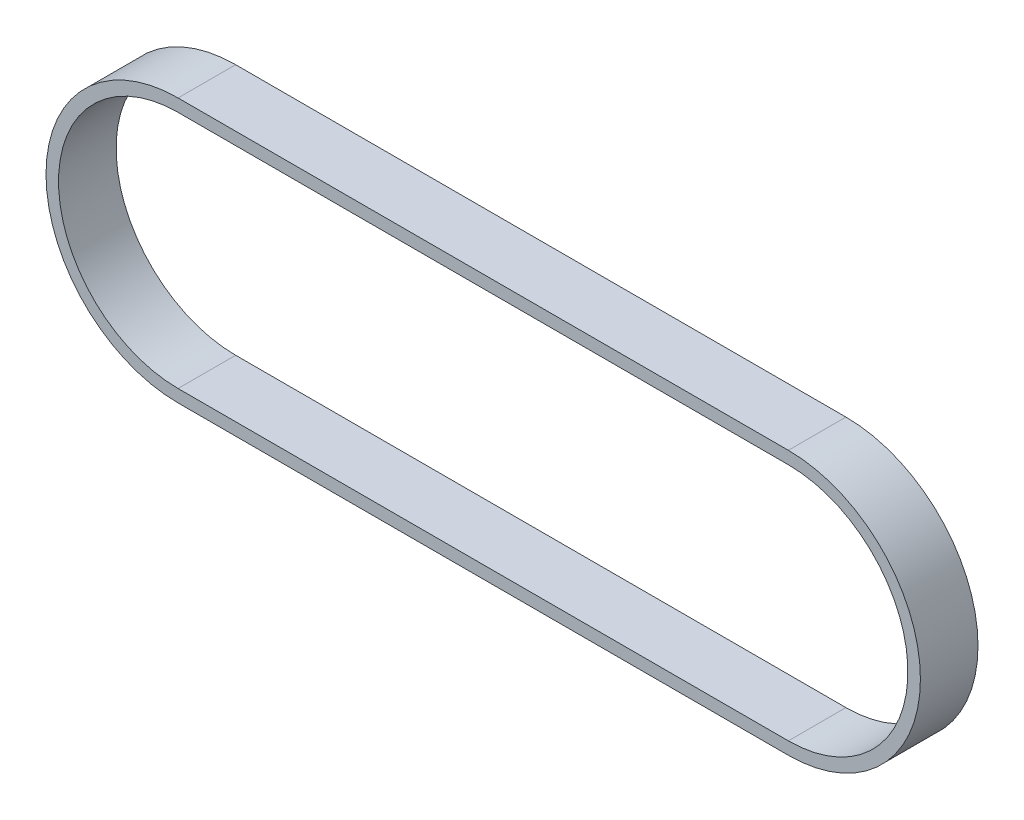
ISO-10303-21;
HEADER;
FILE_DESCRIPTION(('STEP AP214'),'2;1');
FILE_NAME('part.step','',(''),(''),'','','');
FILE_SCHEMA(('AUTOMOTIVE_DESIGN { 1 0 10303 214 1 1 1 1 }'));
ENDSEC;
DATA;
#1=APPLICATION_CONTEXT('core data for automotive mechanical design processes');
#2=APPLICATION_PROTOCOL_DEFINITION('international standard','automotive_design',2000,#1);
#3=PRODUCT_CONTEXT('',#1,'mechanical');
#4=PRODUCT('Part','Part','',(#3));
#5=PRODUCT_RELATED_PRODUCT_CATEGORY('part','',(#4));
#6=PRODUCT_DEFINITION_FORMATION('','',#4);
#7=PRODUCT_DEFINITION_CONTEXT('part definition',#1,'design');
#8=PRODUCT_DEFINITION('design','',#6,#7);
#9=PRODUCT_DEFINITION_SHAPE('','',#8);
#10=(LENGTH_UNIT() NAMED_UNIT(*) SI_UNIT(.MILLI.,.METRE.));
#11=(NAMED_UNIT(*) PLANE_ANGLE_UNIT() SI_UNIT($,.RADIAN.));
#12=(NAMED_UNIT(*) SI_UNIT($,.STERADIAN.) SOLID_ANGLE_UNIT());
#13=UNCERTAINTY_MEASURE_WITH_UNIT(LENGTH_MEASURE(1.E-05),#10,'distance_accuracy_value','');
#14=(GEOMETRIC_REPRESENTATION_CONTEXT(3) GLOBAL_UNCERTAINTY_ASSIGNED_CONTEXT((#13)) GLOBAL_UNIT_ASSIGNED_CONTEXT((#10,
#11,#12)) REPRESENTATION_CONTEXT('',''));
#15=CARTESIAN_POINT('',(0.,0.,0.));
#16=DIRECTION('',(0.,0.,1.));
#17=DIRECTION('',(1.,0.,0.));
#18=AXIS2_PLACEMENT_3D('',#15,#16,#17);
#19=CARTESIAN_POINT('',(0.,0.,9.2));
#20=DIRECTION('',(0.,0.,1.));
#21=DIRECTION('',(1.,0.,0.));
#22=AXIS2_PLACEMENT_3D('',#19,#20,#21);
#23=PLANE('',#22);
#24=CARTESIAN_POINT('',(0.,0.,9.2));
#25=DIRECTION('',(0.,0.,1.));
#26=DIRECTION('',(1.,0.,0.));
#27=AXIS2_PLACEMENT_3D('',#24,#25,#26);
#28=CIRCLE('',#27,21.1);
#29=CARTESIAN_POINT('',(0.,21.1,9.2));
#30=VERTEX_POINT('',#29);
#31=CARTESIAN_POINT('',(0.,-21.1,9.2));
#32=VERTEX_POINT('',#31);
#33=EDGE_CURVE('E158',#30,#32,#28,.T.);
#34=ORIENTED_EDGE('',*,*,#33,.T.);
#35=DIRECTION('',(1.,0.,0.));
#36=VECTOR('',#35,1.);
#37=CARTESIAN_POINT('',(0.,-21.1,9.2));
#38=LINE('',#37,#36);
#39=CARTESIAN_POINT('',(97.5,-21.1,9.2));
#40=VERTEX_POINT('',#39);
#41=EDGE_CURVE('E161',#32,#40,#38,.T.);
#42=ORIENTED_EDGE('',*,*,#41,.T.);
#43=CARTESIAN_POINT('',(97.5,0.,9.2));
#44=DIRECTION('',(0.,0.,1.));
#45=DIRECTION('',(1.,0.,0.));
#46=AXIS2_PLACEMENT_3D('',#43,#44,#45);
#47=CIRCLE('',#46,21.1);
#48=CARTESIAN_POINT('',(97.5,21.1,9.2));
#49=VERTEX_POINT('',#48);
#50=EDGE_CURVE('E164',#40,#49,#47,.T.);
#51=ORIENTED_EDGE('',*,*,#50,.T.);
#52=DIRECTION('',(-1.,0.,0.));
#53=VECTOR('',#52,1.);
#54=CARTESIAN_POINT('',(0.,21.1,9.2));
#55=LINE('',#54,#53);
#56=EDGE_CURVE('E166',#49,#30,#55,.T.);
#57=ORIENTED_EDGE('',*,*,#56,.T.);
#58=EDGE_LOOP('',(#34,#42,#51,#57));
#59=FACE_BOUND('',#58,.T.);
#60=DIRECTION('',(1.,0.,0.));
#61=VECTOR('',#60,1.);
#62=CARTESIAN_POINT('',(0.,-19.1,9.2));
#63=LINE('',#62,#61);
#64=CARTESIAN_POINT('',(0.,-19.1,9.2));
#65=VERTEX_POINT('',#64);
#66=CARTESIAN_POINT('',(97.5,-19.1,9.2));
#67=VERTEX_POINT('',#66);
#68=EDGE_CURVE('E130',#65,#67,#63,.T.);
#69=ORIENTED_EDGE('',*,*,#68,.F.);
#70=CARTESIAN_POINT('',(0.,0.,9.2));
#71=DIRECTION('',(0.,0.,1.));
#72=DIRECTION('',(1.,0.,0.));
#73=AXIS2_PLACEMENT_3D('',#70,#71,#72);
#74=CIRCLE('',#73,19.1);
#75=CARTESIAN_POINT('',(0.,19.1,9.2));
#76=VERTEX_POINT('',#75);
#77=EDGE_CURVE('E122',#76,#65,#74,.T.);
#78=ORIENTED_EDGE('',*,*,#77,.F.);
#79=DIRECTION('',(-1.,0.,0.));
#80=VECTOR('',#79,1.);
#81=CARTESIAN_POINT('',(0.,19.1,9.2));
#82=LINE('',#81,#80);
#83=CARTESIAN_POINT('',(97.5,19.1,9.2));
#84=VERTEX_POINT('',#83);
#85=EDGE_CURVE('E144',#84,#76,#82,.T.);
#86=ORIENTED_EDGE('',*,*,#85,.F.);
#87=CARTESIAN_POINT('',(97.5,0.,9.2));
#88=DIRECTION('',(0.,0.,1.));
#89=DIRECTION('',(1.,0.,0.));
#90=AXIS2_PLACEMENT_3D('',#87,#88,#89);
#91=CIRCLE('',#90,19.1);
#92=EDGE_CURVE('E142',#67,#84,#91,.T.);
#93=ORIENTED_EDGE('',*,*,#92,.F.);
#94=EDGE_LOOP('',(#69,#78,#86,#93));
#95=FACE_BOUND('',#94,.T.);
#96=ADVANCED_FACE('F57',(#59,#95),#23,.T.);
#97=CARTESIAN_POINT('',(0.,0.,0.));
#98=DIRECTION('',(0.,0.,1.));
#99=DIRECTION('',(1.,0.,0.));
#100=AXIS2_PLACEMENT_3D('',#97,#98,#99);
#101=PLANE('',#100);
#102=CARTESIAN_POINT('',(0.,0.,0.));
#103=DIRECTION('',(0.,0.,1.));
#104=DIRECTION('',(1.,0.,0.));
#105=AXIS2_PLACEMENT_3D('',#102,#103,#104);
#106=CIRCLE('',#105,21.1);
#107=CARTESIAN_POINT('',(0.,21.1,0.));
#108=VERTEX_POINT('',#107);
#109=CARTESIAN_POINT('',(0.,-21.1,0.));
#110=VERTEX_POINT('',#109);
#111=EDGE_CURVE('E138',#108,#110,#106,.T.);
#112=ORIENTED_EDGE('',*,*,#111,.F.);
#113=DIRECTION('',(-1.,0.,0.));
#114=VECTOR('',#113,1.);
#115=CARTESIAN_POINT('',(0.,21.1,0.));
#116=LINE('',#115,#114);
#117=CARTESIAN_POINT('',(97.5,21.1,0.));
#118=VERTEX_POINT('',#117);
#119=EDGE_CURVE('E162',#118,#108,#116,.T.);
#120=ORIENTED_EDGE('',*,*,#119,.F.);
#121=CARTESIAN_POINT('',(97.5,0.,0.));
#122=DIRECTION('',(0.,0.,1.));
#123=DIRECTION('',(1.,0.,0.));
#124=AXIS2_PLACEMENT_3D('',#121,#122,#123);
#125=CIRCLE('',#124,21.1);
#126=CARTESIAN_POINT('',(97.5,-21.1,0.));
#127=VERTEX_POINT('',#126);
#128=EDGE_CURVE('E173',#127,#118,#125,.T.);
#129=ORIENTED_EDGE('',*,*,#128,.F.);
#130=DIRECTION('',(1.,0.,0.));
#131=VECTOR('',#130,1.);
#132=CARTESIAN_POINT('',(0.,-21.1,0.));
#133=LINE('',#132,#131);
#134=EDGE_CURVE('E171',#110,#127,#133,.T.);
#135=ORIENTED_EDGE('',*,*,#134,.F.);
#136=EDGE_LOOP('',(#112,#120,#129,#135));
#137=FACE_BOUND('',#136,.T.);
#138=CARTESIAN_POINT('',(0.,0.,0.));
#139=DIRECTION('',(0.,0.,1.));
#140=DIRECTION('',(1.,0.,0.));
#141=AXIS2_PLACEMENT_3D('',#138,#139,#140);
#142=CIRCLE('',#141,19.1);
#143=CARTESIAN_POINT('',(0.,19.1,0.));
#144=VERTEX_POINT('',#143);
#145=CARTESIAN_POINT('',(0.,-19.1,0.));
#146=VERTEX_POINT('',#145);
#147=EDGE_CURVE('E80',#144,#146,#142,.T.);
#148=ORIENTED_EDGE('',*,*,#147,.T.);
#149=DIRECTION('',(1.,0.,0.));
#150=VECTOR('',#149,1.);
#151=CARTESIAN_POINT('',(0.,-19.1,0.));
#152=LINE('',#151,#150);
#153=CARTESIAN_POINT('',(97.5,-19.1,0.));
#154=VERTEX_POINT('',#153);
#155=EDGE_CURVE('E137',#146,#154,#152,.T.);
#156=ORIENTED_EDGE('',*,*,#155,.T.);
#157=CARTESIAN_POINT('',(97.5,0.,0.));
#158=DIRECTION('',(0.,0.,1.));
#159=DIRECTION('',(1.,0.,0.));
#160=AXIS2_PLACEMENT_3D('',#157,#158,#159);
#161=CIRCLE('',#160,19.1);
#162=CARTESIAN_POINT('',(97.5,19.1,0.));
#163=VERTEX_POINT('',#162);
#164=EDGE_CURVE('E150',#154,#163,#161,.T.);
#165=ORIENTED_EDGE('',*,*,#164,.T.);
#166=DIRECTION('',(-1.,0.,0.));
#167=VECTOR('',#166,1.);
#168=CARTESIAN_POINT('',(0.,19.1,0.));
#169=LINE('',#168,#167);
#170=EDGE_CURVE('E131',#163,#144,#169,.T.);
#171=ORIENTED_EDGE('',*,*,#170,.T.);
#172=EDGE_LOOP('',(#148,#156,#165,#171));
#173=FACE_BOUND('',#172,.T.);
#174=ADVANCED_FACE('F191',(#137,#173),#101,.F.);
#175=CARTESIAN_POINT('',(0.,0.,9.2));
#176=DIRECTION('',(0.,0.,-1.));
#177=DIRECTION('',(-1.,0.,0.));
#178=AXIS2_PLACEMENT_3D('',#175,#176,#177);
#179=CYLINDRICAL_SURFACE('',#178,21.1);
#180=ORIENTED_EDGE('',*,*,#111,.T.);
#181=DIRECTION('',(0.,0.,-1.));
#182=VECTOR('',#181,1.);
#183=CARTESIAN_POINT('',(0.,-21.1,9.2));
#184=LINE('',#183,#182);
#185=EDGE_CURVE('E12',#32,#110,#184,.T.);
#186=ORIENTED_EDGE('',*,*,#185,.F.);
#187=ORIENTED_EDGE('',*,*,#33,.F.);
#188=DIRECTION('',(0.,0.,-1.));
#189=VECTOR('',#188,1.);
#190=CARTESIAN_POINT('',(0.,21.1,9.2));
#191=LINE('',#190,#189);
#192=EDGE_CURVE('E168',#30,#108,#191,.T.);
#193=ORIENTED_EDGE('',*,*,#192,.T.);
#194=EDGE_LOOP('',(#180,#186,#187,#193));
#195=FACE_BOUND('',#194,.T.);
#196=ADVANCED_FACE('F59',(#195),#179,.T.);
#197=CARTESIAN_POINT('',(0.,-21.1,9.2));
#198=DIRECTION('',(0.,1.,0.));
#199=DIRECTION('',(-1.,0.,0.));
#200=AXIS2_PLACEMENT_3D('',#197,#198,#199);
#201=PLANE('',#200);
#202=ORIENTED_EDGE('',*,*,#134,.T.);
#203=DIRECTION('',(0.,0.,-1.));
#204=VECTOR('',#203,1.);
#205=CARTESIAN_POINT('',(97.5,-21.1,9.2));
#206=LINE('',#205,#204);
#207=EDGE_CURVE('E65',#40,#127,#206,.T.);
#208=ORIENTED_EDGE('',*,*,#207,.F.);
#209=ORIENTED_EDGE('',*,*,#41,.F.);
#210=ORIENTED_EDGE('',*,*,#185,.T.);
#211=EDGE_LOOP('',(#202,#208,#209,#210));
#212=FACE_BOUND('',#211,.T.);
#213=ADVANCED_FACE('F201',(#212),#201,.F.);
#214=CARTESIAN_POINT('',(97.5,0.,9.2));
#215=DIRECTION('',(0.,0.,-1.));
#216=DIRECTION('',(-1.,0.,0.));
#217=AXIS2_PLACEMENT_3D('',#214,#215,#216);
#218=CYLINDRICAL_SURFACE('',#217,21.1);
#219=ORIENTED_EDGE('',*,*,#128,.T.);
#220=DIRECTION('',(0.,0.,-1.));
#221=VECTOR('',#220,1.);
#222=CARTESIAN_POINT('',(97.5,21.1,9.2));
#223=LINE('',#222,#221);
#224=EDGE_CURVE('E178',#49,#118,#223,.T.);
#225=ORIENTED_EDGE('',*,*,#224,.F.);
#226=ORIENTED_EDGE('',*,*,#50,.F.);
#227=ORIENTED_EDGE('',*,*,#207,.T.);
#228=EDGE_LOOP('',(#219,#225,#226,#227));
#229=FACE_BOUND('',#228,.T.);
#230=ADVANCED_FACE('F185',(#229),#218,.T.);
#231=CARTESIAN_POINT('',(0.,21.1,9.2));
#232=DIRECTION('',(0.,-1.,0.));
#233=DIRECTION('',(1.,0.,0.));
#234=AXIS2_PLACEMENT_3D('',#231,#232,#233);
#235=PLANE('',#234);
#236=ORIENTED_EDGE('',*,*,#119,.T.);
#237=ORIENTED_EDGE('',*,*,#192,.F.);
#238=ORIENTED_EDGE('',*,*,#56,.F.);
#239=ORIENTED_EDGE('',*,*,#224,.T.);
#240=EDGE_LOOP('',(#236,#237,#238,#239));
#241=FACE_BOUND('',#240,.T.);
#242=ADVANCED_FACE('F195',(#241),#235,.F.);
#243=CARTESIAN_POINT('',(0.,0.,9.2));
#244=DIRECTION('',(0.,0.,-1.));
#245=DIRECTION('',(-1.,0.,0.));
#246=AXIS2_PLACEMENT_3D('',#243,#244,#245);
#247=CYLINDRICAL_SURFACE('',#246,19.1);
#248=ORIENTED_EDGE('',*,*,#147,.F.);
#249=DIRECTION('',(0.,0.,-1.));
#250=VECTOR('',#249,1.);
#251=CARTESIAN_POINT('',(0.,19.1,9.2));
#252=LINE('',#251,#250);
#253=EDGE_CURVE('E126',#76,#144,#252,.T.);
#254=ORIENTED_EDGE('',*,*,#253,.F.);
#255=ORIENTED_EDGE('',*,*,#77,.T.);
#256=DIRECTION('',(0.,0.,-1.));
#257=VECTOR('',#256,1.);
#258=CARTESIAN_POINT('',(0.,-19.1,9.2));
#259=LINE('',#258,#257);
#260=EDGE_CURVE('E125',#65,#146,#259,.T.);
#261=ORIENTED_EDGE('',*,*,#260,.T.);
#262=EDGE_LOOP('',(#248,#254,#255,#261));
#263=FACE_BOUND('',#262,.T.);
#264=ADVANCED_FACE('F124',(#263),#247,.F.);
#265=CARTESIAN_POINT('',(0.,-19.1,9.2));
#266=DIRECTION('',(0.,1.,0.));
#267=DIRECTION('',(-1.,0.,0.));
#268=AXIS2_PLACEMENT_3D('',#265,#266,#267);
#269=PLANE('',#268);
#270=ORIENTED_EDGE('',*,*,#155,.F.);
#271=ORIENTED_EDGE('',*,*,#260,.F.);
#272=ORIENTED_EDGE('',*,*,#68,.T.);
#273=DIRECTION('',(0.,0.,-1.));
#274=VECTOR('',#273,1.);
#275=CARTESIAN_POINT('',(97.5,-19.1,9.2));
#276=LINE('',#275,#274);
#277=EDGE_CURVE('E139',#67,#154,#276,.T.);
#278=ORIENTED_EDGE('',*,*,#277,.T.);
#279=EDGE_LOOP('',(#270,#271,#272,#278));
#280=FACE_BOUND('',#279,.T.);
#281=ADVANCED_FACE('F134',(#280),#269,.T.);
#282=CARTESIAN_POINT('',(97.5,0.,9.2));
#283=DIRECTION('',(0.,0.,-1.));
#284=DIRECTION('',(-1.,0.,0.));
#285=AXIS2_PLACEMENT_3D('',#282,#283,#284);
#286=CYLINDRICAL_SURFACE('',#285,19.1);
#287=ORIENTED_EDGE('',*,*,#164,.F.);
#288=ORIENTED_EDGE('',*,*,#277,.F.);
#289=ORIENTED_EDGE('',*,*,#92,.T.);
#290=DIRECTION('',(0.,0.,-1.));
#291=VECTOR('',#290,1.);
#292=CARTESIAN_POINT('',(97.5,19.1,9.2));
#293=LINE('',#292,#291);
#294=EDGE_CURVE('E72',#84,#163,#293,.T.);
#295=ORIENTED_EDGE('',*,*,#294,.T.);
#296=EDGE_LOOP('',(#287,#288,#289,#295));
#297=FACE_BOUND('',#296,.T.);
#298=ADVANCED_FACE('F224',(#297),#286,.F.);
#299=CARTESIAN_POINT('',(0.,19.1,9.2));
#300=DIRECTION('',(0.,-1.,0.));
#301=DIRECTION('',(1.,0.,0.));
#302=AXIS2_PLACEMENT_3D('',#299,#300,#301);
#303=PLANE('',#302);
#304=ORIENTED_EDGE('',*,*,#170,.F.);
#305=ORIENTED_EDGE('',*,*,#294,.F.);
#306=ORIENTED_EDGE('',*,*,#85,.T.);
#307=ORIENTED_EDGE('',*,*,#253,.T.);
#308=EDGE_LOOP('',(#304,#305,#306,#307));
#309=FACE_BOUND('',#308,.T.);
#310=ADVANCED_FACE('F228',(#309),#303,.T.);
#311=CLOSED_SHELL('',(#96,#174,#196,#213,#230,#242,#264,#281,#298,#310));
#312=MANIFOLD_SOLID_BREP('B2',#311);
#313=ADVANCED_BREP_SHAPE_REPRESENTATION('',(#18,#312),#14);
#314=SHAPE_DEFINITION_REPRESENTATION(#9,#313);
ENDSEC;
END-ISO-10303-21;
